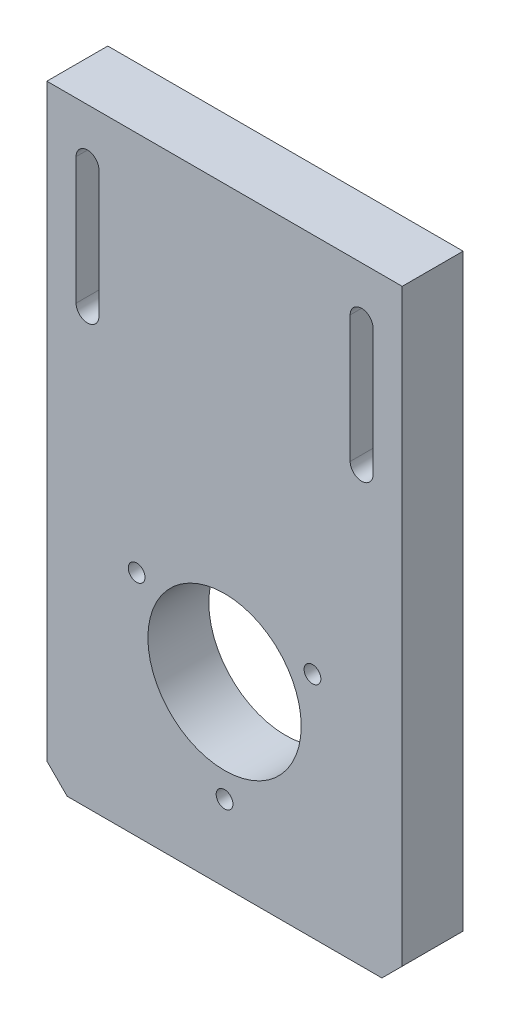
ISO-10303-21;
HEADER;
FILE_DESCRIPTION(('STEP AP214'),'2;1');
FILE_NAME('part.step','',(''),(''),'','','');
FILE_SCHEMA(('AUTOMOTIVE_DESIGN { 1 0 10303 214 1 1 1 1 }'));
ENDSEC;
DATA;
#1=APPLICATION_CONTEXT('core data for automotive mechanical design processes');
#2=APPLICATION_PROTOCOL_DEFINITION('international standard','automotive_design',2000,#1);
#3=PRODUCT_CONTEXT('',#1,'mechanical');
#4=PRODUCT('Part','Part','',(#3));
#5=PRODUCT_RELATED_PRODUCT_CATEGORY('part','',(#4));
#6=PRODUCT_DEFINITION_FORMATION('','',#4);
#7=PRODUCT_DEFINITION_CONTEXT('part definition',#1,'design');
#8=PRODUCT_DEFINITION('design','',#6,#7);
#9=PRODUCT_DEFINITION_SHAPE('','',#8);
#10=(LENGTH_UNIT() NAMED_UNIT(*) SI_UNIT(.MILLI.,.METRE.));
#11=(NAMED_UNIT(*) PLANE_ANGLE_UNIT() SI_UNIT($,.RADIAN.));
#12=(NAMED_UNIT(*) SI_UNIT($,.STERADIAN.) SOLID_ANGLE_UNIT());
#13=UNCERTAINTY_MEASURE_WITH_UNIT(LENGTH_MEASURE(1.E-05),#10,'distance_accuracy_value','');
#14=(GEOMETRIC_REPRESENTATION_CONTEXT(3) GLOBAL_UNCERTAINTY_ASSIGNED_CONTEXT((#13)) GLOBAL_UNIT_ASSIGNED_CONTEXT((#10,
#11,#12)) REPRESENTATION_CONTEXT('',''));
#15=CARTESIAN_POINT('',(0.,0.,0.));
#16=DIRECTION('',(0.,0.,1.));
#17=DIRECTION('',(1.,0.,0.));
#18=AXIS2_PLACEMENT_3D('',#15,#16,#17);
#19=CARTESIAN_POINT('',(27.5,-38.5,12.));
#20=DIRECTION('',(-1.,0.,0.));
#21=DIRECTION('',(0.,-1.,0.));
#22=AXIS2_PLACEMENT_3D('',#19,#20,#21);
#23=PLANE('',#22);
#24=DIRECTION('',(0.,1.,0.));
#25=VECTOR('',#24,1.);
#26=CARTESIAN_POINT('',(27.5,-38.5,0.));
#27=LINE('',#26,#25);
#28=CARTESIAN_POINT('',(27.5,-38.5,0.));
#29=VERTEX_POINT('',#28);
#30=CARTESIAN_POINT('',(27.5,77.5,0.));
#31=VERTEX_POINT('',#30);
#32=EDGE_CURVE('E226',#29,#31,#27,.T.);
#33=ORIENTED_EDGE('',*,*,#32,.T.);
#34=DIRECTION('',(0.,0.,-1.));
#35=VECTOR('',#34,1.);
#36=CARTESIAN_POINT('',(27.5,77.5,12.));
#37=LINE('',#36,#35);
#38=CARTESIAN_POINT('',(27.5,77.5,12.));
#39=VERTEX_POINT('',#38);
#40=EDGE_CURVE('E11',#39,#31,#37,.T.);
#41=ORIENTED_EDGE('',*,*,#40,.F.);
#42=DIRECTION('',(0.,1.,0.));
#43=VECTOR('',#42,1.);
#44=CARTESIAN_POINT('',(27.5,-38.5,12.));
#45=LINE('',#44,#43);
#46=CARTESIAN_POINT('',(27.5,-38.5,12.));
#47=VERTEX_POINT('',#46);
#48=EDGE_CURVE('E229',#47,#39,#45,.T.);
#49=ORIENTED_EDGE('',*,*,#48,.F.);
#50=DIRECTION('',(0.,0.,-1.));
#51=VECTOR('',#50,1.);
#52=CARTESIAN_POINT('',(27.5,-38.5,12.));
#53=LINE('',#52,#51);
#54=EDGE_CURVE('E243',#47,#29,#53,.T.);
#55=ORIENTED_EDGE('',*,*,#54,.T.);
#56=EDGE_LOOP('',(#33,#41,#49,#55));
#57=FACE_BOUND('',#56,.T.);
#58=ADVANCED_FACE('F36',(#57),#23,.F.);
#59=CARTESIAN_POINT('',(-42.5,77.4999999999999,12.));
#60=DIRECTION('',(0.,-1.,0.));
#61=DIRECTION('',(1.,0.,0.));
#62=AXIS2_PLACEMENT_3D('',#59,#60,#61);
#63=PLANE('',#62);
#64=DIRECTION('',(-1.,0.,0.));
#65=VECTOR('',#64,1.);
#66=CARTESIAN_POINT('',(-42.5,77.4999999999999,0.));
#67=LINE('',#66,#65);
#68=CARTESIAN_POINT('',(-42.5,77.4999999999999,0.));
#69=VERTEX_POINT('',#68);
#70=EDGE_CURVE('E246',#31,#69,#67,.T.);
#71=ORIENTED_EDGE('',*,*,#70,.T.);
#72=DIRECTION('',(0.,0.,-1.));
#73=VECTOR('',#72,1.);
#74=CARTESIAN_POINT('',(-42.5,77.4999999999999,12.));
#75=LINE('',#74,#73);
#76=CARTESIAN_POINT('',(-42.5,77.4999999999999,12.));
#77=VERTEX_POINT('',#76);
#78=EDGE_CURVE('E43',#77,#69,#75,.T.);
#79=ORIENTED_EDGE('',*,*,#78,.F.);
#80=DIRECTION('',(-1.,0.,0.));
#81=VECTOR('',#80,1.);
#82=CARTESIAN_POINT('',(-42.5,77.4999999999999,12.));
#83=LINE('',#82,#81);
#84=EDGE_CURVE('E232',#39,#77,#83,.T.);
#85=ORIENTED_EDGE('',*,*,#84,.F.);
#86=ORIENTED_EDGE('',*,*,#40,.T.);
#87=EDGE_LOOP('',(#71,#79,#85,#86));
#88=FACE_BOUND('',#87,.T.);
#89=ADVANCED_FACE('F292',(#88),#63,.F.);
#90=CARTESIAN_POINT('',(-42.5,-38.5,12.));
#91=DIRECTION('',(1.,0.,0.));
#92=DIRECTION('',(0.,0.,-1.));
#93=AXIS2_PLACEMENT_3D('',#90,#91,#92);
#94=PLANE('',#93);
#95=DIRECTION('',(0.,-1.,0.));
#96=VECTOR('',#95,1.);
#97=CARTESIAN_POINT('',(-42.5,-38.5,0.));
#98=LINE('',#97,#96);
#99=CARTESIAN_POINT('',(-42.5,-38.5,0.));
#100=VERTEX_POINT('',#99);
#101=EDGE_CURVE('E248',#69,#100,#98,.T.);
#102=ORIENTED_EDGE('',*,*,#101,.T.);
#103=DIRECTION('',(0.,0.,-1.));
#104=VECTOR('',#103,1.);
#105=CARTESIAN_POINT('',(-42.5,-38.5,12.));
#106=LINE('',#105,#104);
#107=CARTESIAN_POINT('',(-42.5,-38.5,12.));
#108=VERTEX_POINT('',#107);
#109=EDGE_CURVE('E263',#108,#100,#106,.T.);
#110=ORIENTED_EDGE('',*,*,#109,.F.);
#111=DIRECTION('',(0.,-1.,0.));
#112=VECTOR('',#111,1.);
#113=CARTESIAN_POINT('',(-42.5,-38.5,12.));
#114=LINE('',#113,#112);
#115=EDGE_CURVE('E235',#77,#108,#114,.T.);
#116=ORIENTED_EDGE('',*,*,#115,.F.);
#117=ORIENTED_EDGE('',*,*,#78,.T.);
#118=EDGE_LOOP('',(#102,#110,#116,#117));
#119=FACE_BOUND('',#118,.T.);
#120=ADVANCED_FACE('F270',(#119),#94,.F.);
#121=CARTESIAN_POINT('',(-42.5,-38.5,12.));
#122=DIRECTION('',(0.707106781186548,0.707106781186548,0.));
#123=DIRECTION('',(-0.707106781186548,0.707106781186548,0.));
#124=AXIS2_PLACEMENT_3D('',#121,#122,#123);
#125=PLANE('',#124);
#126=DIRECTION('',(0.707106781186547,-0.707106781186547,0.));
#127=VECTOR('',#126,1.);
#128=CARTESIAN_POINT('',(-42.5,-38.5,0.));
#129=LINE('',#128,#127);
#130=CARTESIAN_POINT('',(-38.5,-42.5,0.));
#131=VERTEX_POINT('',#130);
#132=EDGE_CURVE('E250',#100,#131,#129,.T.);
#133=ORIENTED_EDGE('',*,*,#132,.T.);
#134=DIRECTION('',(0.,0.,-1.));
#135=VECTOR('',#134,1.);
#136=CARTESIAN_POINT('',(-38.5,-42.5,12.));
#137=LINE('',#136,#135);
#138=CARTESIAN_POINT('',(-38.5,-42.5,12.));
#139=VERTEX_POINT('',#138);
#140=EDGE_CURVE('E260',#139,#131,#137,.T.);
#141=ORIENTED_EDGE('',*,*,#140,.F.);
#142=DIRECTION('',(0.707106781186547,-0.707106781186547,0.));
#143=VECTOR('',#142,1.);
#144=CARTESIAN_POINT('',(-42.5,-38.5,12.));
#145=LINE('',#144,#143);
#146=EDGE_CURVE('E237',#108,#139,#145,.T.);
#147=ORIENTED_EDGE('',*,*,#146,.F.);
#148=ORIENTED_EDGE('',*,*,#109,.T.);
#149=EDGE_LOOP('',(#133,#141,#147,#148));
#150=FACE_BOUND('',#149,.T.);
#151=ADVANCED_FACE('F280',(#150),#125,.F.);
#152=CARTESIAN_POINT('',(-38.5,-42.5,12.));
#153=DIRECTION('',(0.,1.,0.));
#154=DIRECTION('',(0.,0.,1.));
#155=AXIS2_PLACEMENT_3D('',#152,#153,#154);
#156=PLANE('',#155);
#157=DIRECTION('',(1.,0.,0.));
#158=VECTOR('',#157,1.);
#159=CARTESIAN_POINT('',(-38.5,-42.5,0.));
#160=LINE('',#159,#158);
#161=CARTESIAN_POINT('',(23.5,-42.5,0.));
#162=VERTEX_POINT('',#161);
#163=EDGE_CURVE('E252',#131,#162,#160,.T.);
#164=ORIENTED_EDGE('',*,*,#163,.T.);
#165=DIRECTION('',(0.,0.,-1.));
#166=VECTOR('',#165,1.);
#167=CARTESIAN_POINT('',(23.5,-42.5,12.));
#168=LINE('',#167,#166);
#169=CARTESIAN_POINT('',(23.5,-42.5,12.));
#170=VERTEX_POINT('',#169);
#171=EDGE_CURVE('E257',#170,#162,#168,.T.);
#172=ORIENTED_EDGE('',*,*,#171,.F.);
#173=DIRECTION('',(1.,0.,0.));
#174=VECTOR('',#173,1.);
#175=CARTESIAN_POINT('',(-38.5,-42.5,12.));
#176=LINE('',#175,#174);
#177=EDGE_CURVE('E239',#139,#170,#176,.T.);
#178=ORIENTED_EDGE('',*,*,#177,.F.);
#179=ORIENTED_EDGE('',*,*,#140,.T.);
#180=EDGE_LOOP('',(#164,#172,#178,#179));
#181=FACE_BOUND('',#180,.T.);
#182=ADVANCED_FACE('F284',(#181),#156,.F.);
#183=CARTESIAN_POINT('',(23.5,-42.5,12.));
#184=DIRECTION('',(-0.707106781186548,0.707106781186547,0.));
#185=DIRECTION('',(-0.707106781186547,-0.707106781186548,0.));
#186=AXIS2_PLACEMENT_3D('',#183,#184,#185);
#187=PLANE('',#186);
#188=DIRECTION('',(0.707106781186547,0.707106781186548,0.));
#189=VECTOR('',#188,1.);
#190=CARTESIAN_POINT('',(23.5,-42.5,0.));
#191=LINE('',#190,#189);
#192=EDGE_CURVE('E233',#162,#29,#191,.T.);
#193=ORIENTED_EDGE('',*,*,#192,.T.);
#194=ORIENTED_EDGE('',*,*,#54,.F.);
#195=DIRECTION('',(0.707106781186547,0.707106781186548,0.));
#196=VECTOR('',#195,1.);
#197=CARTESIAN_POINT('',(23.5,-42.5,12.));
#198=LINE('',#197,#196);
#199=EDGE_CURVE('E241',#170,#47,#198,.T.);
#200=ORIENTED_EDGE('',*,*,#199,.F.);
#201=ORIENTED_EDGE('',*,*,#171,.T.);
#202=EDGE_LOOP('',(#193,#194,#200,#201));
#203=FACE_BOUND('',#202,.T.);
#204=ADVANCED_FACE('F295',(#203),#187,.F.);
#205=CARTESIAN_POINT('',(0.,0.,12.));
#206=DIRECTION('',(0.,0.,-1.));
#207=DIRECTION('',(-1.,0.,0.));
#208=AXIS2_PLACEMENT_3D('',#205,#206,#207);
#209=PLANE('',#208);
#210=DIRECTION('',(0.,-1.,0.));
#211=VECTOR('',#210,1.);
#212=CARTESIAN_POINT('',(17.25,67.4999999999999,12.));
#213=LINE('',#212,#211);
#214=CARTESIAN_POINT('',(17.25,67.4999999999999,12.));
#215=VERTEX_POINT('',#214);
#216=CARTESIAN_POINT('',(17.25,42.4999999999999,12.));
#217=VERTEX_POINT('',#216);
#218=EDGE_CURVE('E163',#215,#217,#213,.T.);
#219=ORIENTED_EDGE('',*,*,#218,.F.);
#220=CARTESIAN_POINT('',(19.5,67.4999999999999,12.));
#221=DIRECTION('',(0.,0.,1.));
#222=DIRECTION('',(-1.,0.,0.));
#223=AXIS2_PLACEMENT_3D('',#220,#221,#222);
#224=CIRCLE('',#223,2.25);
#225=CARTESIAN_POINT('',(21.75,67.4999999999999,12.));
#226=VERTEX_POINT('',#225);
#227=EDGE_CURVE('E50',#226,#215,#224,.T.);
#228=ORIENTED_EDGE('',*,*,#227,.F.);
#229=DIRECTION('',(0.,1.,0.));
#230=VECTOR('',#229,1.);
#231=CARTESIAN_POINT('',(21.75,67.4999999999999,12.));
#232=LINE('',#231,#230);
#233=CARTESIAN_POINT('',(21.75,42.4999999999999,12.));
#234=VERTEX_POINT('',#233);
#235=EDGE_CURVE('E154',#234,#226,#232,.T.);
#236=ORIENTED_EDGE('',*,*,#235,.F.);
#237=CARTESIAN_POINT('',(19.5,42.4999999999999,12.));
#238=DIRECTION('',(0.,0.,1.));
#239=DIRECTION('',(-1.,0.,0.));
#240=AXIS2_PLACEMENT_3D('',#237,#238,#239);
#241=CIRCLE('',#240,2.25);
#242=EDGE_CURVE('E157',#217,#234,#241,.T.);
#243=ORIENTED_EDGE('',*,*,#242,.F.);
#244=EDGE_LOOP('',(#219,#228,#236,#243));
#245=FACE_BOUND('',#244,.T.);
#246=DIRECTION('',(0.,-1.,0.));
#247=VECTOR('',#246,1.);
#248=CARTESIAN_POINT('',(-36.75,67.4999999999999,12.));
#249=LINE('',#248,#247);
#250=CARTESIAN_POINT('',(-36.75,67.4999999999999,12.));
#251=VERTEX_POINT('',#250);
#252=CARTESIAN_POINT('',(-36.75,42.4999999999999,12.));
#253=VERTEX_POINT('',#252);
#254=EDGE_CURVE('E188',#251,#253,#249,.T.);
#255=ORIENTED_EDGE('',*,*,#254,.F.);
#256=CARTESIAN_POINT('',(-34.5,67.4999999999999,12.));
#257=DIRECTION('',(0.,0.,1.));
#258=DIRECTION('',(1.,0.,0.));
#259=AXIS2_PLACEMENT_3D('',#256,#257,#258);
#260=CIRCLE('',#259,2.25);
#261=CARTESIAN_POINT('',(-32.25,67.4999999999999,12.));
#262=VERTEX_POINT('',#261);
#263=EDGE_CURVE('E169',#262,#251,#260,.T.);
#264=ORIENTED_EDGE('',*,*,#263,.F.);
#265=DIRECTION('',(0.,1.,0.));
#266=VECTOR('',#265,1.);
#267=CARTESIAN_POINT('',(-32.25,67.4999999999999,12.));
#268=LINE('',#267,#266);
#269=CARTESIAN_POINT('',(-32.25,42.4999999999999,12.));
#270=VERTEX_POINT('',#269);
#271=EDGE_CURVE('E177',#270,#262,#268,.T.);
#272=ORIENTED_EDGE('',*,*,#271,.F.);
#273=CARTESIAN_POINT('',(-34.5,42.4999999999999,12.));
#274=DIRECTION('',(0.,0.,1.));
#275=DIRECTION('',(1.,0.,0.));
#276=AXIS2_PLACEMENT_3D('',#273,#274,#275);
#277=CIRCLE('',#276,2.25);
#278=EDGE_CURVE('E191',#253,#270,#277,.T.);
#279=ORIENTED_EDGE('',*,*,#278,.F.);
#280=EDGE_LOOP('',(#255,#264,#272,#279));
#281=FACE_BOUND('',#280,.T.);
#282=CARTESIAN_POINT('',(-7.49999999999999,-27.5,12.));
#283=DIRECTION('',(0.,0.,1.));
#284=DIRECTION('',(1.,0.,0.));
#285=AXIS2_PLACEMENT_3D('',#282,#283,#284);
#286=CIRCLE('',#285,1.64999999999999);
#287=CARTESIAN_POINT('',(-5.85,-27.5,12.));
#288=VERTEX_POINT('',#287);
#289=EDGE_CURVE('E198',#288,#288,#286,.T.);
#290=ORIENTED_EDGE('',*,*,#289,.F.);
#291=EDGE_LOOP('',(#290));
#292=FACE_BOUND('',#291,.T.);
#293=CARTESIAN_POINT('',(-24.8205080756887,2.50000000000009,12.));
#294=DIRECTION('',(0.,0.,1.));
#295=DIRECTION('',(1.,0.,0.));
#296=AXIS2_PLACEMENT_3D('',#293,#294,#295);
#297=CIRCLE('',#296,1.64999999999999);
#298=CARTESIAN_POINT('',(-23.1705080756887,2.50000000000009,12.));
#299=VERTEX_POINT('',#298);
#300=EDGE_CURVE('E210',#299,#299,#297,.T.);
#301=ORIENTED_EDGE('',*,*,#300,.F.);
#302=EDGE_LOOP('',(#301));
#303=FACE_BOUND('',#302,.T.);
#304=CARTESIAN_POINT('',(9.82050807568888,2.49999999999985,12.));
#305=DIRECTION('',(0.,0.,1.));
#306=DIRECTION('',(1.,0.,0.));
#307=AXIS2_PLACEMENT_3D('',#304,#305,#306);
#308=CIRCLE('',#307,1.64999999999999);
#309=CARTESIAN_POINT('',(11.4705080756889,2.49999999999985,12.));
#310=VERTEX_POINT('',#309);
#311=EDGE_CURVE('E216',#310,#310,#308,.T.);
#312=ORIENTED_EDGE('',*,*,#311,.F.);
#313=EDGE_LOOP('',(#312));
#314=FACE_BOUND('',#313,.T.);
#315=CARTESIAN_POINT('',(-7.49999999999999,-7.49999999999999,12.));
#316=DIRECTION('',(0.,0.,1.));
#317=DIRECTION('',(1.,0.,0.));
#318=AXIS2_PLACEMENT_3D('',#315,#316,#317);
#319=CIRCLE('',#318,15.1);
#320=CARTESIAN_POINT('',(7.60000000000001,-7.49999999999999,12.));
#321=VERTEX_POINT('',#320);
#322=EDGE_CURVE('E222',#321,#321,#319,.T.);
#323=ORIENTED_EDGE('',*,*,#322,.F.);
#324=EDGE_LOOP('',(#323));
#325=FACE_BOUND('',#324,.T.);
#326=ORIENTED_EDGE('',*,*,#48,.T.);
#327=ORIENTED_EDGE('',*,*,#84,.T.);
#328=ORIENTED_EDGE('',*,*,#115,.T.);
#329=ORIENTED_EDGE('',*,*,#146,.T.);
#330=ORIENTED_EDGE('',*,*,#177,.T.);
#331=ORIENTED_EDGE('',*,*,#199,.T.);
#332=EDGE_LOOP('',(#326,#327,#328,#329,#330,#331));
#333=FACE_BOUND('',#332,.T.);
#334=ADVANCED_FACE('F288',(#245,#281,#292,#303,#314,#325,#333),#209,.F.);
#335=CARTESIAN_POINT('',(0.,0.,0.));
#336=DIRECTION('',(0.,0.,-1.));
#337=DIRECTION('',(-1.,0.,0.));
#338=AXIS2_PLACEMENT_3D('',#335,#336,#337);
#339=PLANE('',#338);
#340=CARTESIAN_POINT('',(19.5,67.4999999999999,0.));
#341=DIRECTION('',(0.,0.,1.));
#342=DIRECTION('',(-1.,0.,0.));
#343=AXIS2_PLACEMENT_3D('',#340,#341,#342);
#344=CIRCLE('',#343,2.25);
#345=CARTESIAN_POINT('',(21.75,67.4999999999999,0.));
#346=VERTEX_POINT('',#345);
#347=CARTESIAN_POINT('',(17.25,67.4999999999999,0.));
#348=VERTEX_POINT('',#347);
#349=EDGE_CURVE('E138',#346,#348,#344,.T.);
#350=ORIENTED_EDGE('',*,*,#349,.T.);
#351=DIRECTION('',(0.,-1.,0.));
#352=VECTOR('',#351,1.);
#353=CARTESIAN_POINT('',(17.25,67.4999999999999,0.));
#354=LINE('',#353,#352);
#355=CARTESIAN_POINT('',(17.25,42.4999999999999,0.));
#356=VERTEX_POINT('',#355);
#357=EDGE_CURVE('E147',#348,#356,#354,.T.);
#358=ORIENTED_EDGE('',*,*,#357,.T.);
#359=CARTESIAN_POINT('',(19.5,42.4999999999999,0.));
#360=DIRECTION('',(0.,0.,1.));
#361=DIRECTION('',(-1.,0.,0.));
#362=AXIS2_PLACEMENT_3D('',#359,#360,#361);
#363=CIRCLE('',#362,2.25);
#364=CARTESIAN_POINT('',(21.75,42.4999999999999,0.));
#365=VERTEX_POINT('',#364);
#366=EDGE_CURVE('E58',#356,#365,#363,.T.);
#367=ORIENTED_EDGE('',*,*,#366,.T.);
#368=DIRECTION('',(0.,1.,0.));
#369=VECTOR('',#368,1.);
#370=CARTESIAN_POINT('',(21.75,67.4999999999999,0.));
#371=LINE('',#370,#369);
#372=EDGE_CURVE('E144',#365,#346,#371,.T.);
#373=ORIENTED_EDGE('',*,*,#372,.T.);
#374=EDGE_LOOP('',(#350,#358,#367,#373));
#375=FACE_BOUND('',#374,.T.);
#376=CARTESIAN_POINT('',(-34.5,67.4999999999999,0.));
#377=DIRECTION('',(0.,0.,1.));
#378=DIRECTION('',(1.,0.,0.));
#379=AXIS2_PLACEMENT_3D('',#376,#377,#378);
#380=CIRCLE('',#379,2.25);
#381=CARTESIAN_POINT('',(-32.25,67.4999999999999,0.));
#382=VERTEX_POINT('',#381);
#383=CARTESIAN_POINT('',(-36.75,67.4999999999999,0.));
#384=VERTEX_POINT('',#383);
#385=EDGE_CURVE('E173',#382,#384,#380,.T.);
#386=ORIENTED_EDGE('',*,*,#385,.T.);
#387=DIRECTION('',(0.,-1.,0.));
#388=VECTOR('',#387,1.);
#389=CARTESIAN_POINT('',(-36.75,67.4999999999999,0.));
#390=LINE('',#389,#388);
#391=CARTESIAN_POINT('',(-36.75,42.4999999999999,0.));
#392=VERTEX_POINT('',#391);
#393=EDGE_CURVE('E176',#384,#392,#390,.T.);
#394=ORIENTED_EDGE('',*,*,#393,.T.);
#395=CARTESIAN_POINT('',(-34.5,42.4999999999999,0.));
#396=DIRECTION('',(0.,0.,1.));
#397=DIRECTION('',(1.,0.,0.));
#398=AXIS2_PLACEMENT_3D('',#395,#396,#397);
#399=CIRCLE('',#398,2.25);
#400=CARTESIAN_POINT('',(-32.25,42.4999999999999,0.));
#401=VERTEX_POINT('',#400);
#402=EDGE_CURVE('E180',#392,#401,#399,.T.);
#403=ORIENTED_EDGE('',*,*,#402,.T.);
#404=DIRECTION('',(0.,1.,0.));
#405=VECTOR('',#404,1.);
#406=CARTESIAN_POINT('',(-32.25,67.4999999999999,0.));
#407=LINE('',#406,#405);
#408=EDGE_CURVE('E183',#401,#382,#407,.T.);
#409=ORIENTED_EDGE('',*,*,#408,.T.);
#410=EDGE_LOOP('',(#386,#394,#403,#409));
#411=FACE_BOUND('',#410,.T.);
#412=CARTESIAN_POINT('',(-7.49999999999999,-27.5,0.));
#413=DIRECTION('',(0.,0.,1.));
#414=DIRECTION('',(1.,0.,0.));
#415=AXIS2_PLACEMENT_3D('',#412,#413,#414);
#416=CIRCLE('',#415,1.65);
#417=CARTESIAN_POINT('',(-5.85,-27.5,0.));
#418=VERTEX_POINT('',#417);
#419=EDGE_CURVE('E207',#418,#418,#416,.T.);
#420=ORIENTED_EDGE('',*,*,#419,.T.);
#421=EDGE_LOOP('',(#420));
#422=FACE_BOUND('',#421,.T.);
#423=CARTESIAN_POINT('',(-24.8205080756887,2.50000000000009,0.));
#424=DIRECTION('',(0.,0.,1.));
#425=DIRECTION('',(1.,0.,0.));
#426=AXIS2_PLACEMENT_3D('',#423,#424,#425);
#427=CIRCLE('',#426,1.65);
#428=CARTESIAN_POINT('',(-23.1705080756887,2.50000000000009,0.));
#429=VERTEX_POINT('',#428);
#430=EDGE_CURVE('E213',#429,#429,#427,.T.);
#431=ORIENTED_EDGE('',*,*,#430,.T.);
#432=EDGE_LOOP('',(#431));
#433=FACE_BOUND('',#432,.T.);
#434=CARTESIAN_POINT('',(9.82050807568888,2.49999999999985,0.));
#435=DIRECTION('',(0.,0.,1.));
#436=DIRECTION('',(1.,0.,0.));
#437=AXIS2_PLACEMENT_3D('',#434,#435,#436);
#438=CIRCLE('',#437,1.65);
#439=CARTESIAN_POINT('',(11.4705080756889,2.49999999999985,0.));
#440=VERTEX_POINT('',#439);
#441=EDGE_CURVE('E219',#440,#440,#438,.T.);
#442=ORIENTED_EDGE('',*,*,#441,.T.);
#443=EDGE_LOOP('',(#442));
#444=FACE_BOUND('',#443,.T.);
#445=CARTESIAN_POINT('',(-7.49999999999999,-7.49999999999999,0.));
#446=DIRECTION('',(0.,0.,1.));
#447=DIRECTION('',(1.,0.,0.));
#448=AXIS2_PLACEMENT_3D('',#445,#446,#447);
#449=CIRCLE('',#448,15.1);
#450=CARTESIAN_POINT('',(7.60000000000001,-7.49999999999999,0.));
#451=VERTEX_POINT('',#450);
#452=EDGE_CURVE('E223',#451,#451,#449,.T.);
#453=ORIENTED_EDGE('',*,*,#452,.T.);
#454=EDGE_LOOP('',(#453));
#455=FACE_BOUND('',#454,.T.);
#456=ORIENTED_EDGE('',*,*,#32,.F.);
#457=ORIENTED_EDGE('',*,*,#192,.F.);
#458=ORIENTED_EDGE('',*,*,#163,.F.);
#459=ORIENTED_EDGE('',*,*,#132,.F.);
#460=ORIENTED_EDGE('',*,*,#101,.F.);
#461=ORIENTED_EDGE('',*,*,#70,.F.);
#462=EDGE_LOOP('',(#456,#457,#458,#459,#460,#461));
#463=FACE_BOUND('',#462,.T.);
#464=ADVANCED_FACE('F151',(#375,#411,#422,#433,#444,#455,#463),#339,.T.);
#465=CARTESIAN_POINT('',(-7.49999999999999,-7.49999999999999,0.));
#466=DIRECTION('',(0.,0.,1.));
#467=DIRECTION('',(1.,0.,0.));
#468=AXIS2_PLACEMENT_3D('',#465,#466,#467);
#469=CYLINDRICAL_SURFACE('',#468,15.1);
#470=ORIENTED_EDGE('',*,*,#452,.F.);
#471=EDGE_LOOP('',(#470));
#472=FACE_BOUND('',#471,.T.);
#473=ORIENTED_EDGE('',*,*,#322,.T.);
#474=EDGE_LOOP('',(#473));
#475=FACE_BOUND('',#474,.T.);
#476=ADVANCED_FACE('F345',(#472,#475),#469,.F.);
#477=CARTESIAN_POINT('',(9.82050807568888,2.49999999999985,12.));
#478=DIRECTION('',(0.,0.,1.));
#479=DIRECTION('',(1.,0.,0.));
#480=AXIS2_PLACEMENT_3D('',#477,#478,#479);
#481=CYLINDRICAL_SURFACE('',#480,1.64999999999999);
#482=ORIENTED_EDGE('',*,*,#441,.F.);
#483=EDGE_LOOP('',(#482));
#484=FACE_BOUND('',#483,.T.);
#485=ORIENTED_EDGE('',*,*,#311,.T.);
#486=EDGE_LOOP('',(#485));
#487=FACE_BOUND('',#486,.T.);
#488=ADVANCED_FACE('F353',(#484,#487),#481,.F.);
#489=CARTESIAN_POINT('',(-24.8205080756887,2.50000000000009,12.));
#490=DIRECTION('',(0.,0.,1.));
#491=DIRECTION('',(1.,0.,0.));
#492=AXIS2_PLACEMENT_3D('',#489,#490,#491);
#493=CYLINDRICAL_SURFACE('',#492,1.64999999999999);
#494=ORIENTED_EDGE('',*,*,#430,.F.);
#495=EDGE_LOOP('',(#494));
#496=FACE_BOUND('',#495,.T.);
#497=ORIENTED_EDGE('',*,*,#300,.T.);
#498=EDGE_LOOP('',(#497));
#499=FACE_BOUND('',#498,.T.);
#500=ADVANCED_FACE('F456',(#496,#499),#493,.F.);
#501=CARTESIAN_POINT('',(-7.49999999999999,-27.5,12.));
#502=DIRECTION('',(0.,0.,1.));
#503=DIRECTION('',(1.,0.,0.));
#504=AXIS2_PLACEMENT_3D('',#501,#502,#503);
#505=CYLINDRICAL_SURFACE('',#504,1.64999999999999);
#506=ORIENTED_EDGE('',*,*,#419,.F.);
#507=EDGE_LOOP('',(#506));
#508=FACE_BOUND('',#507,.T.);
#509=ORIENTED_EDGE('',*,*,#289,.T.);
#510=EDGE_LOOP('',(#509));
#511=FACE_BOUND('',#510,.T.);
#512=ADVANCED_FACE('F366',(#508,#511),#505,.F.);
#513=CARTESIAN_POINT('',(-34.5,67.4999999999999,0.));
#514=DIRECTION('',(0.,0.,1.));
#515=DIRECTION('',(1.,0.,0.));
#516=AXIS2_PLACEMENT_3D('',#513,#514,#515);
#517=CYLINDRICAL_SURFACE('',#516,2.25);
#518=ORIENTED_EDGE('',*,*,#263,.T.);
#519=DIRECTION('',(0.,0.,1.));
#520=VECTOR('',#519,1.);
#521=CARTESIAN_POINT('',(-36.75,67.4999999999999,0.));
#522=LINE('',#521,#520);
#523=EDGE_CURVE('E186',#384,#251,#522,.T.);
#524=ORIENTED_EDGE('',*,*,#523,.F.);
#525=ORIENTED_EDGE('',*,*,#385,.F.);
#526=DIRECTION('',(0.,0.,1.));
#527=VECTOR('',#526,1.);
#528=CARTESIAN_POINT('',(-32.25,67.4999999999999,0.));
#529=LINE('',#528,#527);
#530=EDGE_CURVE('E196',#382,#262,#529,.T.);
#531=ORIENTED_EDGE('',*,*,#530,.T.);
#532=EDGE_LOOP('',(#518,#524,#525,#531));
#533=FACE_BOUND('',#532,.T.);
#534=ADVANCED_FACE('F361',(#533),#517,.F.);
#535=CARTESIAN_POINT('',(-32.25,67.4999999999999,0.));
#536=DIRECTION('',(1.,0.,0.));
#537=DIRECTION('',(0.,0.,-1.));
#538=AXIS2_PLACEMENT_3D('',#535,#536,#537);
#539=PLANE('',#538);
#540=ORIENTED_EDGE('',*,*,#271,.T.);
#541=ORIENTED_EDGE('',*,*,#530,.F.);
#542=ORIENTED_EDGE('',*,*,#408,.F.);
#543=DIRECTION('',(0.,0.,1.));
#544=VECTOR('',#543,1.);
#545=CARTESIAN_POINT('',(-32.25,42.4999999999999,0.));
#546=LINE('',#545,#544);
#547=EDGE_CURVE('E199',#401,#270,#546,.T.);
#548=ORIENTED_EDGE('',*,*,#547,.T.);
#549=EDGE_LOOP('',(#540,#541,#542,#548));
#550=FACE_BOUND('',#549,.T.);
#551=ADVANCED_FACE('F365',(#550),#539,.F.);
#552=CARTESIAN_POINT('',(-34.5,42.4999999999999,0.));
#553=DIRECTION('',(0.,0.,1.));
#554=DIRECTION('',(1.,0.,0.));
#555=AXIS2_PLACEMENT_3D('',#552,#553,#554);
#556=CYLINDRICAL_SURFACE('',#555,2.25);
#557=ORIENTED_EDGE('',*,*,#278,.T.);
#558=ORIENTED_EDGE('',*,*,#547,.F.);
#559=ORIENTED_EDGE('',*,*,#402,.F.);
#560=DIRECTION('',(0.,0.,1.));
#561=VECTOR('',#560,1.);
#562=CARTESIAN_POINT('',(-36.75,42.4999999999999,0.));
#563=LINE('',#562,#561);
#564=EDGE_CURVE('E201',#392,#253,#563,.T.);
#565=ORIENTED_EDGE('',*,*,#564,.T.);
#566=EDGE_LOOP('',(#557,#558,#559,#565));
#567=FACE_BOUND('',#566,.T.);
#568=ADVANCED_FACE('F377',(#567),#556,.F.);
#569=CARTESIAN_POINT('',(-36.75,67.4999999999999,0.));
#570=DIRECTION('',(-1.,0.,0.));
#571=DIRECTION('',(0.,-1.,0.));
#572=AXIS2_PLACEMENT_3D('',#569,#570,#571);
#573=PLANE('',#572);
#574=ORIENTED_EDGE('',*,*,#254,.T.);
#575=ORIENTED_EDGE('',*,*,#564,.F.);
#576=ORIENTED_EDGE('',*,*,#393,.F.);
#577=ORIENTED_EDGE('',*,*,#523,.T.);
#578=EDGE_LOOP('',(#574,#575,#576,#577));
#579=FACE_BOUND('',#578,.T.);
#580=ADVANCED_FACE('F387',(#579),#573,.F.);
#581=CARTESIAN_POINT('',(19.5,67.4999999999999,0.));
#582=DIRECTION('',(0.,0.,1.));
#583=DIRECTION('',(1.,0.,0.));
#584=AXIS2_PLACEMENT_3D('',#581,#582,#583);
#585=CYLINDRICAL_SURFACE('',#584,2.25);
#586=ORIENTED_EDGE('',*,*,#227,.T.);
#587=DIRECTION('',(0.,0.,1.));
#588=VECTOR('',#587,1.);
#589=CARTESIAN_POINT('',(17.25,67.4999999999999,0.));
#590=LINE('',#589,#588);
#591=EDGE_CURVE('E134',#348,#215,#590,.T.);
#592=ORIENTED_EDGE('',*,*,#591,.F.);
#593=ORIENTED_EDGE('',*,*,#349,.F.);
#594=DIRECTION('',(0.,0.,1.));
#595=VECTOR('',#594,1.);
#596=CARTESIAN_POINT('',(21.75,67.4999999999999,0.));
#597=LINE('',#596,#595);
#598=EDGE_CURVE('E167',#346,#226,#597,.T.);
#599=ORIENTED_EDGE('',*,*,#598,.T.);
#600=EDGE_LOOP('',(#586,#592,#593,#599));
#601=FACE_BOUND('',#600,.T.);
#602=ADVANCED_FACE('F136',(#601),#585,.F.);
#603=CARTESIAN_POINT('',(21.75,67.4999999999999,0.));
#604=DIRECTION('',(1.,0.,0.));
#605=DIRECTION('',(0.,1.,0.));
#606=AXIS2_PLACEMENT_3D('',#603,#604,#605);
#607=PLANE('',#606);
#608=ORIENTED_EDGE('',*,*,#235,.T.);
#609=ORIENTED_EDGE('',*,*,#598,.F.);
#610=ORIENTED_EDGE('',*,*,#372,.F.);
#611=DIRECTION('',(0.,0.,1.));
#612=VECTOR('',#611,1.);
#613=CARTESIAN_POINT('',(21.75,42.4999999999999,0.));
#614=LINE('',#613,#612);
#615=EDGE_CURVE('E170',#365,#234,#614,.T.);
#616=ORIENTED_EDGE('',*,*,#615,.T.);
#617=EDGE_LOOP('',(#608,#609,#610,#616));
#618=FACE_BOUND('',#617,.T.);
#619=ADVANCED_FACE('F406',(#618),#607,.F.);
#620=CARTESIAN_POINT('',(19.5,42.4999999999999,0.));
#621=DIRECTION('',(0.,0.,1.));
#622=DIRECTION('',(1.,0.,0.));
#623=AXIS2_PLACEMENT_3D('',#620,#621,#622);
#624=CYLINDRICAL_SURFACE('',#623,2.25);
#625=ORIENTED_EDGE('',*,*,#242,.T.);
#626=ORIENTED_EDGE('',*,*,#615,.F.);
#627=ORIENTED_EDGE('',*,*,#366,.F.);
#628=DIRECTION('',(0.,0.,1.));
#629=VECTOR('',#628,1.);
#630=CARTESIAN_POINT('',(17.25,42.4999999999999,0.));
#631=LINE('',#630,#629);
#632=EDGE_CURVE('E143',#356,#217,#631,.T.);
#633=ORIENTED_EDGE('',*,*,#632,.T.);
#634=EDGE_LOOP('',(#625,#626,#627,#633));
#635=FACE_BOUND('',#634,.T.);
#636=ADVANCED_FACE('F415',(#635),#624,.F.);
#637=CARTESIAN_POINT('',(17.25,67.4999999999999,0.));
#638=DIRECTION('',(-1.,0.,0.));
#639=DIRECTION('',(0.,0.,1.));
#640=AXIS2_PLACEMENT_3D('',#637,#638,#639);
#641=PLANE('',#640);
#642=ORIENTED_EDGE('',*,*,#218,.T.);
#643=ORIENTED_EDGE('',*,*,#632,.F.);
#644=ORIENTED_EDGE('',*,*,#357,.F.);
#645=ORIENTED_EDGE('',*,*,#591,.T.);
#646=EDGE_LOOP('',(#642,#643,#644,#645));
#647=FACE_BOUND('',#646,.T.);
#648=ADVANCED_FACE('F148',(#647),#641,.F.);
#649=CLOSED_SHELL('',(#58,#89,#120,#151,#182,#204,#334,#464,#476,#488,#500,#512,#534,#551,#568,
#580,#602,#619,#636,#648));
#650=MANIFOLD_SOLID_BREP('B2',#649);
#651=ADVANCED_BREP_SHAPE_REPRESENTATION('',(#18,#650),#14);
#652=SHAPE_DEFINITION_REPRESENTATION(#9,#651);
ENDSEC;
END-ISO-10303-21;
